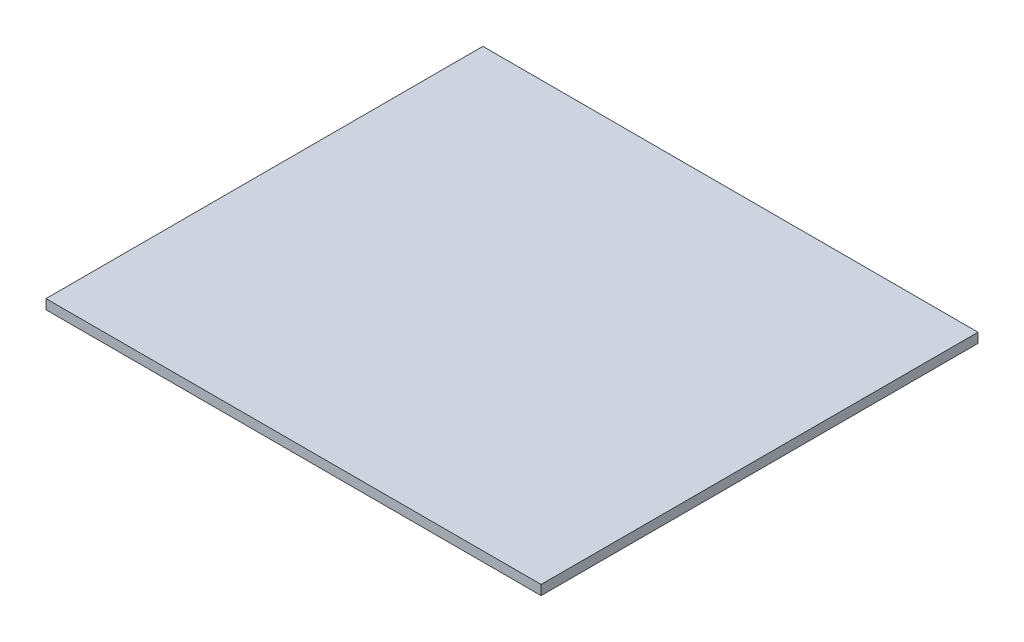
ISO-10303-21;
HEADER;
FILE_DESCRIPTION(('STEP AP214'),'2;1');
FILE_NAME('part.step','',(''),(''),'','','');
FILE_SCHEMA(('AUTOMOTIVE_DESIGN { 1 0 10303 214 1 1 1 1 }'));
ENDSEC;
DATA;
#1=APPLICATION_CONTEXT('core data for automotive mechanical design processes');
#2=APPLICATION_PROTOCOL_DEFINITION('international standard','automotive_design',2000,#1);
#3=PRODUCT_CONTEXT('',#1,'mechanical');
#4=PRODUCT('Part','Part','',(#3));
#5=PRODUCT_RELATED_PRODUCT_CATEGORY('part','',(#4));
#6=PRODUCT_DEFINITION_FORMATION('','',#4);
#7=PRODUCT_DEFINITION_CONTEXT('part definition',#1,'design');
#8=PRODUCT_DEFINITION('design','',#6,#7);
#9=PRODUCT_DEFINITION_SHAPE('','',#8);
#10=(LENGTH_UNIT() NAMED_UNIT(*) SI_UNIT(.MILLI.,.METRE.));
#11=(NAMED_UNIT(*) PLANE_ANGLE_UNIT() SI_UNIT($,.RADIAN.));
#12=(NAMED_UNIT(*) SI_UNIT($,.STERADIAN.) SOLID_ANGLE_UNIT());
#13=UNCERTAINTY_MEASURE_WITH_UNIT(LENGTH_MEASURE(1.E-05),#10,'distance_accuracy_value','');
#14=(GEOMETRIC_REPRESENTATION_CONTEXT(3) GLOBAL_UNCERTAINTY_ASSIGNED_CONTEXT((#13)) GLOBAL_UNIT_ASSIGNED_CONTEXT((#10,
#11,#12)) REPRESENTATION_CONTEXT('',''));
#15=CARTESIAN_POINT('',(0.,0.,0.));
#16=DIRECTION('',(0.,0.,1.));
#17=DIRECTION('',(1.,0.,0.));
#18=AXIS2_PLACEMENT_3D('',#15,#16,#17);
#19=CARTESIAN_POINT('',(-51.,2.,45.));
#20=DIRECTION('',(1.,0.,0.));
#21=DIRECTION('',(0.,0.,-1.));
#22=AXIS2_PLACEMENT_3D('',#19,#20,#21);
#23=PLANE('',#22);
#24=DIRECTION('',(0.,0.,1.));
#25=VECTOR('',#24,1.);
#26=CARTESIAN_POINT('',(-51.,0.,45.));
#27=LINE('',#26,#25);
#28=CARTESIAN_POINT('',(-51.,0.,-45.));
#29=VERTEX_POINT('',#28);
#30=CARTESIAN_POINT('',(-51.,0.,45.));
#31=VERTEX_POINT('',#30);
#32=EDGE_CURVE('E99',#29,#31,#27,.T.);
#33=ORIENTED_EDGE('',*,*,#32,.T.);
#34=DIRECTION('',(0.,-1.,0.));
#35=VECTOR('',#34,1.);
#36=CARTESIAN_POINT('',(-51.,2.,45.));
#37=LINE('',#36,#35);
#38=CARTESIAN_POINT('',(-51.,2.,45.));
#39=VERTEX_POINT('',#38);
#40=EDGE_CURVE('E11',#39,#31,#37,.T.);
#41=ORIENTED_EDGE('',*,*,#40,.F.);
#42=DIRECTION('',(0.,0.,1.));
#43=VECTOR('',#42,1.);
#44=CARTESIAN_POINT('',(-51.,2.,45.));
#45=LINE('',#44,#43);
#46=CARTESIAN_POINT('',(-51.,2.,-45.));
#47=VERTEX_POINT('',#46);
#48=EDGE_CURVE('E87',#47,#39,#45,.T.);
#49=ORIENTED_EDGE('',*,*,#48,.F.);
#50=DIRECTION('',(0.,-1.,0.));
#51=VECTOR('',#50,1.);
#52=CARTESIAN_POINT('',(-51.,2.,-45.));
#53=LINE('',#52,#51);
#54=EDGE_CURVE('E95',#47,#29,#53,.T.);
#55=ORIENTED_EDGE('',*,*,#54,.T.);
#56=EDGE_LOOP('',(#33,#41,#49,#55));
#57=FACE_BOUND('',#56,.T.);
#58=ADVANCED_FACE('F36',(#57),#23,.F.);
#59=CARTESIAN_POINT('',(51.,2.,45.));
#60=DIRECTION('',(0.,0.,-1.));
#61=DIRECTION('',(-1.,0.,0.));
#62=AXIS2_PLACEMENT_3D('',#59,#60,#61);
#63=PLANE('',#62);
#64=DIRECTION('',(1.,0.,0.));
#65=VECTOR('',#64,1.);
#66=CARTESIAN_POINT('',(51.,0.,45.));
#67=LINE('',#66,#65);
#68=CARTESIAN_POINT('',(51.,0.,45.));
#69=VERTEX_POINT('',#68);
#70=EDGE_CURVE('E91',#31,#69,#67,.T.);
#71=ORIENTED_EDGE('',*,*,#70,.T.);
#72=DIRECTION('',(0.,-1.,0.));
#73=VECTOR('',#72,1.);
#74=CARTESIAN_POINT('',(51.,2.,45.));
#75=LINE('',#74,#73);
#76=CARTESIAN_POINT('',(51.,2.,45.));
#77=VERTEX_POINT('',#76);
#78=EDGE_CURVE('E44',#77,#69,#75,.T.);
#79=ORIENTED_EDGE('',*,*,#78,.F.);
#80=DIRECTION('',(1.,0.,0.));
#81=VECTOR('',#80,1.);
#82=CARTESIAN_POINT('',(51.,2.,45.));
#83=LINE('',#82,#81);
#84=EDGE_CURVE('E82',#39,#77,#83,.T.);
#85=ORIENTED_EDGE('',*,*,#84,.F.);
#86=ORIENTED_EDGE('',*,*,#40,.T.);
#87=EDGE_LOOP('',(#71,#79,#85,#86));
#88=FACE_BOUND('',#87,.T.);
#89=ADVANCED_FACE('F90',(#88),#63,.F.);
#90=CARTESIAN_POINT('',(51.,2.,45.));
#91=DIRECTION('',(-1.,0.,0.));
#92=DIRECTION('',(0.,0.,1.));
#93=AXIS2_PLACEMENT_3D('',#90,#91,#92);
#94=PLANE('',#93);
#95=DIRECTION('',(0.,0.,-1.));
#96=VECTOR('',#95,1.);
#97=CARTESIAN_POINT('',(51.,0.,45.));
#98=LINE('',#97,#96);
#99=CARTESIAN_POINT('',(51.,0.,-45.));
#100=VERTEX_POINT('',#99);
#101=EDGE_CURVE('E69',#69,#100,#98,.T.);
#102=ORIENTED_EDGE('',*,*,#101,.T.);
#103=DIRECTION('',(0.,-1.,0.));
#104=VECTOR('',#103,1.);
#105=CARTESIAN_POINT('',(51.,2.,-45.));
#106=LINE('',#105,#104);
#107=CARTESIAN_POINT('',(51.,2.,-45.));
#108=VERTEX_POINT('',#107);
#109=EDGE_CURVE('E92',#108,#100,#106,.T.);
#110=ORIENTED_EDGE('',*,*,#109,.F.);
#111=DIRECTION('',(0.,0.,-1.));
#112=VECTOR('',#111,1.);
#113=CARTESIAN_POINT('',(51.,2.,45.));
#114=LINE('',#113,#112);
#115=EDGE_CURVE('E85',#77,#108,#114,.T.);
#116=ORIENTED_EDGE('',*,*,#115,.F.);
#117=ORIENTED_EDGE('',*,*,#78,.T.);
#118=EDGE_LOOP('',(#102,#110,#116,#117));
#119=FACE_BOUND('',#118,.T.);
#120=ADVANCED_FACE('F93',(#119),#94,.F.);
#121=CARTESIAN_POINT('',(51.,2.,-45.));
#122=DIRECTION('',(0.,0.,1.));
#123=DIRECTION('',(1.,0.,0.));
#124=AXIS2_PLACEMENT_3D('',#121,#122,#123);
#125=PLANE('',#124);
#126=DIRECTION('',(-1.,0.,0.));
#127=VECTOR('',#126,1.);
#128=CARTESIAN_POINT('',(51.,0.,-45.));
#129=LINE('',#128,#127);
#130=EDGE_CURVE('E75',#100,#29,#129,.T.);
#131=ORIENTED_EDGE('',*,*,#130,.T.);
#132=ORIENTED_EDGE('',*,*,#54,.F.);
#133=DIRECTION('',(-1.,0.,0.));
#134=VECTOR('',#133,1.);
#135=CARTESIAN_POINT('',(51.,2.,-45.));
#136=LINE('',#135,#134);
#137=EDGE_CURVE('E52',#108,#47,#136,.T.);
#138=ORIENTED_EDGE('',*,*,#137,.F.);
#139=ORIENTED_EDGE('',*,*,#109,.T.);
#140=EDGE_LOOP('',(#131,#132,#138,#139));
#141=FACE_BOUND('',#140,.T.);
#142=ADVANCED_FACE('F106',(#141),#125,.F.);
#143=CARTESIAN_POINT('',(0.,2.,0.));
#144=DIRECTION('',(0.,1.,0.));
#145=DIRECTION('',(0.,0.,1.));
#146=AXIS2_PLACEMENT_3D('',#143,#144,#145);
#147=PLANE('',#146);
#148=ORIENTED_EDGE('',*,*,#48,.T.);
#149=ORIENTED_EDGE('',*,*,#84,.T.);
#150=ORIENTED_EDGE('',*,*,#115,.T.);
#151=ORIENTED_EDGE('',*,*,#137,.T.);
#152=EDGE_LOOP('',(#148,#149,#150,#151));
#153=FACE_BOUND('',#152,.T.);
#154=ADVANCED_FACE('F83',(#153),#147,.T.);
#155=CARTESIAN_POINT('',(0.,0.,0.));
#156=DIRECTION('',(0.,1.,0.));
#157=DIRECTION('',(0.,0.,1.));
#158=AXIS2_PLACEMENT_3D('',#155,#156,#157);
#159=PLANE('',#158);
#160=ORIENTED_EDGE('',*,*,#32,.F.);
#161=ORIENTED_EDGE('',*,*,#130,.F.);
#162=ORIENTED_EDGE('',*,*,#101,.F.);
#163=ORIENTED_EDGE('',*,*,#70,.F.);
#164=EDGE_LOOP('',(#160,#161,#162,#163));
#165=FACE_BOUND('',#164,.T.);
#166=ADVANCED_FACE('F109',(#165),#159,.F.);
#167=CLOSED_SHELL('',(#58,#89,#120,#142,#154,#166));
#168=MANIFOLD_SOLID_BREP('B2',#167);
#169=ADVANCED_BREP_SHAPE_REPRESENTATION('',(#18,#168),#14);
#170=SHAPE_DEFINITION_REPRESENTATION(#9,#169);
ENDSEC;
END-ISO-10303-21;
